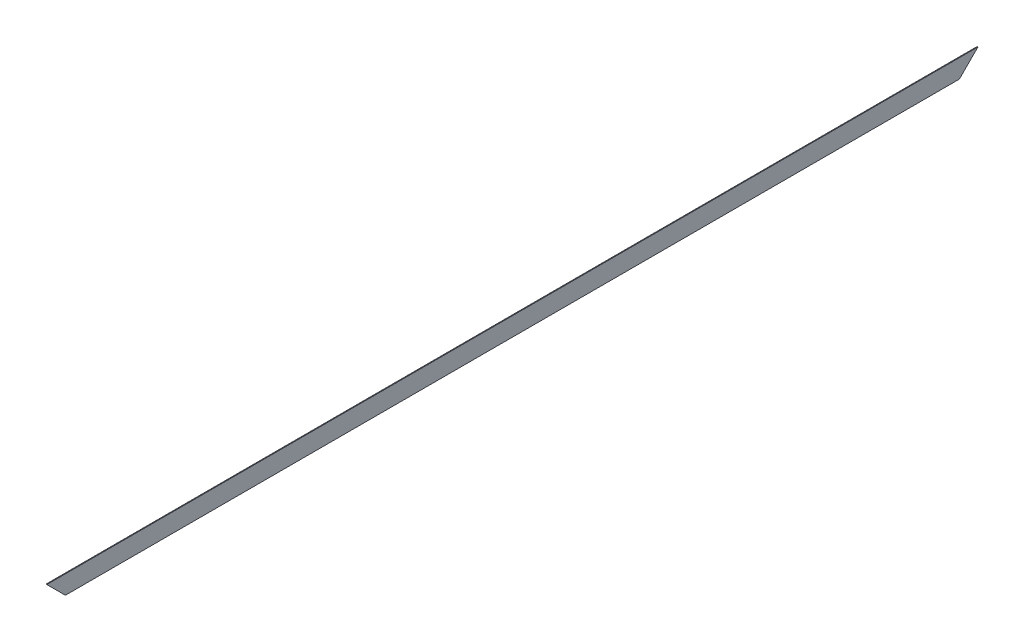
ISO-10303-21;
HEADER;
FILE_DESCRIPTION(('STEP AP214'),'2;1');
FILE_NAME('part.step','',(''),(''),'','','');
FILE_SCHEMA(('AUTOMOTIVE_DESIGN { 1 0 10303 214 1 1 1 1 }'));
ENDSEC;
DATA;
#1=APPLICATION_CONTEXT('core data for automotive mechanical design processes');
#2=APPLICATION_PROTOCOL_DEFINITION('international standard','automotive_design',2000,#1);
#3=PRODUCT_CONTEXT('',#1,'mechanical');
#4=PRODUCT('Part','Part','',(#3));
#5=PRODUCT_RELATED_PRODUCT_CATEGORY('part','',(#4));
#6=PRODUCT_DEFINITION_FORMATION('','',#4);
#7=PRODUCT_DEFINITION_CONTEXT('part definition',#1,'design');
#8=PRODUCT_DEFINITION('design','',#6,#7);
#9=PRODUCT_DEFINITION_SHAPE('','',#8);
#10=(LENGTH_UNIT() NAMED_UNIT(*) SI_UNIT(.MILLI.,.METRE.));
#11=(NAMED_UNIT(*) PLANE_ANGLE_UNIT() SI_UNIT($,.RADIAN.));
#12=(NAMED_UNIT(*) SI_UNIT($,.STERADIAN.) SOLID_ANGLE_UNIT());
#13=UNCERTAINTY_MEASURE_WITH_UNIT(LENGTH_MEASURE(1.E-05),#10,'distance_accuracy_value','');
#14=(GEOMETRIC_REPRESENTATION_CONTEXT(3) GLOBAL_UNCERTAINTY_ASSIGNED_CONTEXT((#13)) GLOBAL_UNIT_ASSIGNED_CONTEXT((#10,
#11,#12)) REPRESENTATION_CONTEXT('',''));
#15=CARTESIAN_POINT('',(0.,0.,0.));
#16=DIRECTION('',(0.,0.,1.));
#17=DIRECTION('',(1.,0.,0.));
#18=AXIS2_PLACEMENT_3D('',#15,#16,#17);
#19=CARTESIAN_POINT('',(4.77501925,0.,1500.));
#20=DIRECTION('',(0.,-1.,0.));
#21=DIRECTION('',(1.,0.,0.));
#22=AXIS2_PLACEMENT_3D('',#19,#20,#21);
#23=PLANE('',#22);
#24=DIRECTION('',(0.,0.,-1.));
#25=VECTOR('',#24,1.);
#26=CARTESIAN_POINT('',(-25.22498075,0.,1500.));
#27=LINE('',#26,#25);
#28=CARTESIAN_POINT('',(-25.22498075,0.,1470.));
#29=VERTEX_POINT('',#28);
#30=CARTESIAN_POINT('',(-25.22498075,0.,30.));
#31=VERTEX_POINT('',#30);
#32=EDGE_CURVE('E38',#29,#31,#27,.T.);
#33=ORIENTED_EDGE('',*,*,#32,.T.);
#34=DIRECTION('',(-1.,0.,0.));
#35=VECTOR('',#34,1.);
#36=CARTESIAN_POINT('',(10.,0.,30.));
#37=LINE('',#36,#35);
#38=CARTESIAN_POINT('',(4.77501925,0.,30.));
#39=VERTEX_POINT('',#38);
#40=EDGE_CURVE('E51',#39,#31,#37,.T.);
#41=ORIENTED_EDGE('',*,*,#40,.F.);
#42=DIRECTION('',(0.,0.,-1.));
#43=VECTOR('',#42,1.);
#44=CARTESIAN_POINT('',(4.77501925,0.,1500.));
#45=LINE('',#44,#43);
#46=CARTESIAN_POINT('',(4.77501925,0.,1470.));
#47=VERTEX_POINT('',#46);
#48=EDGE_CURVE('E11',#47,#39,#45,.T.);
#49=ORIENTED_EDGE('',*,*,#48,.F.);
#50=DIRECTION('',(-1.,0.,0.));
#51=VECTOR('',#50,1.);
#52=CARTESIAN_POINT('',(10.,0.,1470.));
#53=LINE('',#52,#51);
#54=EDGE_CURVE('E100',#47,#29,#53,.T.);
#55=ORIENTED_EDGE('',*,*,#54,.T.);
#56=EDGE_LOOP('',(#33,#41,#49,#55));
#57=FACE_BOUND('',#56,.T.);
#58=ADVANCED_FACE('F35',(#57),#23,.T.);
#59=CARTESIAN_POINT('',(4.77501925,0.,1500.));
#60=DIRECTION('',(1.,0.,0.));
#61=DIRECTION('',(0.,1.,0.));
#62=AXIS2_PLACEMENT_3D('',#59,#60,#61);
#63=PLANE('',#62);
#64=ORIENTED_EDGE('',*,*,#48,.T.);
#65=DIRECTION('',(0.,0.707106781186548,-0.707106781186548));
#66=VECTOR('',#65,1.);
#67=CARTESIAN_POINT('',(4.77501924999998,-735.,765.));
#68=LINE('',#67,#66);
#69=CARTESIAN_POINT('',(4.77501925,30.,0.));
#70=VERTEX_POINT('',#69);
#71=EDGE_CURVE('E93',#39,#70,#68,.T.);
#72=ORIENTED_EDGE('',*,*,#71,.T.);
#73=DIRECTION('',(0.,0.,-1.));
#74=VECTOR('',#73,1.);
#75=CARTESIAN_POINT('',(4.77501925,30.,1500.));
#76=LINE('',#75,#74);
#77=CARTESIAN_POINT('',(4.77501925,30.,1500.));
#78=VERTEX_POINT('',#77);
#79=EDGE_CURVE('E43',#78,#70,#76,.T.);
#80=ORIENTED_EDGE('',*,*,#79,.F.);
#81=DIRECTION('',(0.,-0.707106781186547,-0.707106781186548));
#82=VECTOR('',#81,1.);
#83=CARTESIAN_POINT('',(4.77501925,15.,1485.));
#84=LINE('',#83,#82);
#85=EDGE_CURVE('E111',#78,#47,#84,.T.);
#86=ORIENTED_EDGE('',*,*,#85,.T.);
#87=EDGE_LOOP('',(#64,#72,#80,#86));
#88=FACE_BOUND('',#87,.T.);
#89=ADVANCED_FACE('F110',(#88),#63,.T.);
#90=CARTESIAN_POINT('',(4.77501925,27.,1500.));
#91=DIRECTION('',(0.,0.,-1.));
#92=DIRECTION('',(-1.,0.,0.));
#93=AXIS2_PLACEMENT_3D('',#90,#91,#92);
#94=CYLINDRICAL_SURFACE('',#93,3.);
#95=ORIENTED_EDGE('',*,*,#79,.T.);
#96=CARTESIAN_POINT('',(4.77501925,27.,3.00000000000011));
#97=DIRECTION('',(0.,-0.707106781186548,-0.707106781186548));
#98=DIRECTION('',(0.,0.707106781186548,-0.707106781186548));
#99=AXIS2_PLACEMENT_3D('',#96,#97,#98);
#100=ELLIPSE('',#99,4.24264068711929,3.);
#101=CARTESIAN_POINT('',(1.77501925,26.9999999999998,3.00000000000034));
#102=VERTEX_POINT('',#101);
#103=EDGE_CURVE('E96',#70,#102,#100,.F.);
#104=ORIENTED_EDGE('',*,*,#103,.T.);
#105=DIRECTION('',(0.,0.,-1.));
#106=VECTOR('',#105,1.);
#107=CARTESIAN_POINT('',(1.77501925,27.,1500.));
#108=LINE('',#107,#106);
#109=CARTESIAN_POINT('',(1.77501925,27.,1497.));
#110=VERTEX_POINT('',#109);
#111=EDGE_CURVE('E121',#110,#102,#108,.T.);
#112=ORIENTED_EDGE('',*,*,#111,.F.);
#113=CARTESIAN_POINT('',(4.77501925,27.,1497.));
#114=DIRECTION('',(0.,-0.707106781186548,0.707106781186547));
#115=DIRECTION('',(0.,-0.707106781186547,-0.707106781186548));
#116=AXIS2_PLACEMENT_3D('',#113,#114,#115);
#117=ELLIPSE('',#116,4.24264068711929,3.);
#118=EDGE_CURVE('E113',#110,#78,#117,.F.);
#119=ORIENTED_EDGE('',*,*,#118,.T.);
#120=EDGE_LOOP('',(#95,#104,#112,#119));
#121=FACE_BOUND('',#120,.T.);
#122=ADVANCED_FACE('F160',(#121),#94,.T.);
#123=CARTESIAN_POINT('',(1.77501925,27.,1500.));
#124=DIRECTION('',(-1.,0.,0.));
#125=DIRECTION('',(0.,-1.,0.));
#126=AXIS2_PLACEMENT_3D('',#123,#124,#125);
#127=PLANE('',#126);
#128=ORIENTED_EDGE('',*,*,#111,.T.);
#129=DIRECTION('',(0.,-0.707106781186548,0.707106781186548));
#130=VECTOR('',#129,1.);
#131=CARTESIAN_POINT('',(1.7750192499999,-721.5,751.5));
#132=LINE('',#131,#130);
#133=CARTESIAN_POINT('',(1.77501925,8.,22.));
#134=VERTEX_POINT('',#133);
#135=EDGE_CURVE('E142',#102,#134,#132,.T.);
#136=ORIENTED_EDGE('',*,*,#135,.T.);
#137=DIRECTION('',(0.,0.,-1.));
#138=VECTOR('',#137,1.);
#139=CARTESIAN_POINT('',(1.77501925,8.,1500.));
#140=LINE('',#139,#138);
#141=CARTESIAN_POINT('',(1.77501925,8.,1478.));
#142=VERTEX_POINT('',#141);
#143=EDGE_CURVE('E124',#142,#134,#140,.T.);
#144=ORIENTED_EDGE('',*,*,#143,.F.);
#145=DIRECTION('',(0.,0.707106781186547,0.707106781186548));
#146=VECTOR('',#145,1.);
#147=CARTESIAN_POINT('',(1.77501925,28.5,1498.5));
#148=LINE('',#147,#146);
#149=EDGE_CURVE('E116',#142,#110,#148,.T.);
#150=ORIENTED_EDGE('',*,*,#149,.T.);
#151=EDGE_LOOP('',(#128,#136,#144,#150));
#152=FACE_BOUND('',#151,.T.);
#153=ADVANCED_FACE('F158',(#152),#127,.T.);
#154=CARTESIAN_POINT('',(-3.22498075000001,8.,1500.));
#155=DIRECTION('',(0.,0.,-1.));
#156=DIRECTION('',(-1.,0.,0.));
#157=AXIS2_PLACEMENT_3D('',#154,#155,#156);
#158=CYLINDRICAL_SURFACE('',#157,5.);
#159=ORIENTED_EDGE('',*,*,#143,.T.);
#160=CARTESIAN_POINT('',(-3.22498075000001,8.,22.));
#161=DIRECTION('',(0.,-0.707106781186548,-0.707106781186548));
#162=DIRECTION('',(0.,0.707106781186548,-0.707106781186548));
#163=AXIS2_PLACEMENT_3D('',#160,#161,#162);
#164=ELLIPSE('',#163,7.07106781186548,5.);
#165=CARTESIAN_POINT('',(-3.22498075000001,3.,26.9999999999999));
#166=VERTEX_POINT('',#165);
#167=EDGE_CURVE('E140',#134,#166,#164,.T.);
#168=ORIENTED_EDGE('',*,*,#167,.T.);
#169=DIRECTION('',(0.,0.,-1.));
#170=VECTOR('',#169,1.);
#171=CARTESIAN_POINT('',(-3.22498075,3.,1500.));
#172=LINE('',#171,#170);
#173=CARTESIAN_POINT('',(-3.22498075000001,3.,1473.));
#174=VERTEX_POINT('',#173);
#175=EDGE_CURVE('E127',#174,#166,#172,.T.);
#176=ORIENTED_EDGE('',*,*,#175,.F.);
#177=CARTESIAN_POINT('',(-3.22498075000001,8.,1478.));
#178=DIRECTION('',(0.,-0.707106781186548,0.707106781186547));
#179=DIRECTION('',(0.,-0.707106781186547,-0.707106781186548));
#180=AXIS2_PLACEMENT_3D('',#177,#178,#179);
#181=ELLIPSE('',#180,7.07106781186548,5.);
#182=EDGE_CURVE('E152',#174,#142,#181,.T.);
#183=ORIENTED_EDGE('',*,*,#182,.T.);
#184=EDGE_LOOP('',(#159,#168,#176,#183));
#185=FACE_BOUND('',#184,.T.);
#186=ADVANCED_FACE('F181',(#185),#158,.F.);
#187=CARTESIAN_POINT('',(-22.22498075,3.,1500.));
#188=DIRECTION('',(0.,1.,0.));
#189=DIRECTION('',(-1.,0.,0.));
#190=AXIS2_PLACEMENT_3D('',#187,#188,#189);
#191=PLANE('',#190);
#192=ORIENTED_EDGE('',*,*,#175,.T.);
#193=DIRECTION('',(-1.,0.,0.));
#194=VECTOR('',#193,1.);
#195=CARTESIAN_POINT('',(-22.2249807499997,3.,26.9999999999999));
#196=LINE('',#195,#194);
#197=CARTESIAN_POINT('',(-22.22498075,3.,26.9999999999999));
#198=VERTEX_POINT('',#197);
#199=EDGE_CURVE('E138',#166,#198,#196,.T.);
#200=ORIENTED_EDGE('',*,*,#199,.T.);
#201=DIRECTION('',(0.,0.,-1.));
#202=VECTOR('',#201,1.);
#203=CARTESIAN_POINT('',(-22.22498075,3.,1500.));
#204=LINE('',#203,#202);
#205=CARTESIAN_POINT('',(-22.22498075,3.,1473.));
#206=VERTEX_POINT('',#205);
#207=EDGE_CURVE('E115',#206,#198,#204,.T.);
#208=ORIENTED_EDGE('',*,*,#207,.F.);
#209=DIRECTION('',(1.,0.,0.));
#210=VECTOR('',#209,1.);
#211=CARTESIAN_POINT('',(-22.22498075,3.,1473.));
#212=LINE('',#211,#210);
#213=EDGE_CURVE('E59',#206,#174,#212,.T.);
#214=ORIENTED_EDGE('',*,*,#213,.T.);
#215=EDGE_LOOP('',(#192,#200,#208,#214));
#216=FACE_BOUND('',#215,.T.);
#217=ADVANCED_FACE('F136',(#216),#191,.T.);
#218=CARTESIAN_POINT('',(-22.22498075,0.,1500.));
#219=DIRECTION('',(0.,0.,-1.));
#220=DIRECTION('',(-1.,0.,0.));
#221=AXIS2_PLACEMENT_3D('',#218,#219,#220);
#222=CYLINDRICAL_SURFACE('',#221,3.);
#223=ORIENTED_EDGE('',*,*,#207,.T.);
#224=CARTESIAN_POINT('',(-22.22498075,0.,30.));
#225=DIRECTION('',(0.,-0.707106781186548,-0.707106781186548));
#226=DIRECTION('',(0.,0.707106781186548,-0.707106781186548));
#227=AXIS2_PLACEMENT_3D('',#224,#225,#226);
#228=ELLIPSE('',#227,4.24264068711929,3.);
#229=EDGE_CURVE('E107',#198,#31,#228,.F.);
#230=ORIENTED_EDGE('',*,*,#229,.T.);
#231=ORIENTED_EDGE('',*,*,#32,.F.);
#232=CARTESIAN_POINT('',(-22.22498075,0.,1470.));
#233=DIRECTION('',(0.,-0.707106781186548,0.707106781186547));
#234=DIRECTION('',(0.,-0.707106781186547,-0.707106781186548));
#235=AXIS2_PLACEMENT_3D('',#232,#233,#234);
#236=ELLIPSE('',#235,4.24264068711929,3.);
#237=EDGE_CURVE('E133',#29,#206,#236,.F.);
#238=ORIENTED_EDGE('',*,*,#237,.T.);
#239=EDGE_LOOP('',(#223,#230,#231,#238));
#240=FACE_BOUND('',#239,.T.);
#241=ADVANCED_FACE('F132',(#240),#222,.T.);
#242=CARTESIAN_POINT('',(10.,0.,1470.));
#243=DIRECTION('',(0.,-0.707106781186548,0.707106781186547));
#244=DIRECTION('',(0.,-0.707106781186547,-0.707106781186548));
#245=AXIS2_PLACEMENT_3D('',#242,#243,#244);
#246=PLANE('',#245);
#247=ORIENTED_EDGE('',*,*,#118,.F.);
#248=ORIENTED_EDGE('',*,*,#149,.F.);
#249=ORIENTED_EDGE('',*,*,#182,.F.);
#250=ORIENTED_EDGE('',*,*,#213,.F.);
#251=ORIENTED_EDGE('',*,*,#237,.F.);
#252=ORIENTED_EDGE('',*,*,#54,.F.);
#253=ORIENTED_EDGE('',*,*,#85,.F.);
#254=EDGE_LOOP('',(#247,#248,#249,#250,#251,#252,#253));
#255=FACE_BOUND('',#254,.T.);
#256=ADVANCED_FACE('F161',(#255),#246,.T.);
#257=CARTESIAN_POINT('',(10.,0.,30.));
#258=DIRECTION('',(0.,-0.707106781186548,-0.707106781186548));
#259=DIRECTION('',(0.,0.707106781186548,-0.707106781186548));
#260=AXIS2_PLACEMENT_3D('',#257,#258,#259);
#261=PLANE('',#260);
#262=ORIENTED_EDGE('',*,*,#40,.T.);
#263=ORIENTED_EDGE('',*,*,#229,.F.);
#264=ORIENTED_EDGE('',*,*,#199,.F.);
#265=ORIENTED_EDGE('',*,*,#167,.F.);
#266=ORIENTED_EDGE('',*,*,#135,.F.);
#267=ORIENTED_EDGE('',*,*,#103,.F.);
#268=ORIENTED_EDGE('',*,*,#71,.F.);
#269=EDGE_LOOP('',(#262,#263,#264,#265,#266,#267,#268));
#270=FACE_BOUND('',#269,.T.);
#271=ADVANCED_FACE('F94',(#270),#261,.T.);
#272=CLOSED_SHELL('',(#58,#89,#122,#153,#186,#217,#241,#256,#271));
#273=MANIFOLD_SOLID_BREP('B2',#272);
#274=ADVANCED_BREP_SHAPE_REPRESENTATION('',(#18,#273),#14);
#275=SHAPE_DEFINITION_REPRESENTATION(#9,#274);
ENDSEC;
END-ISO-10303-21;
